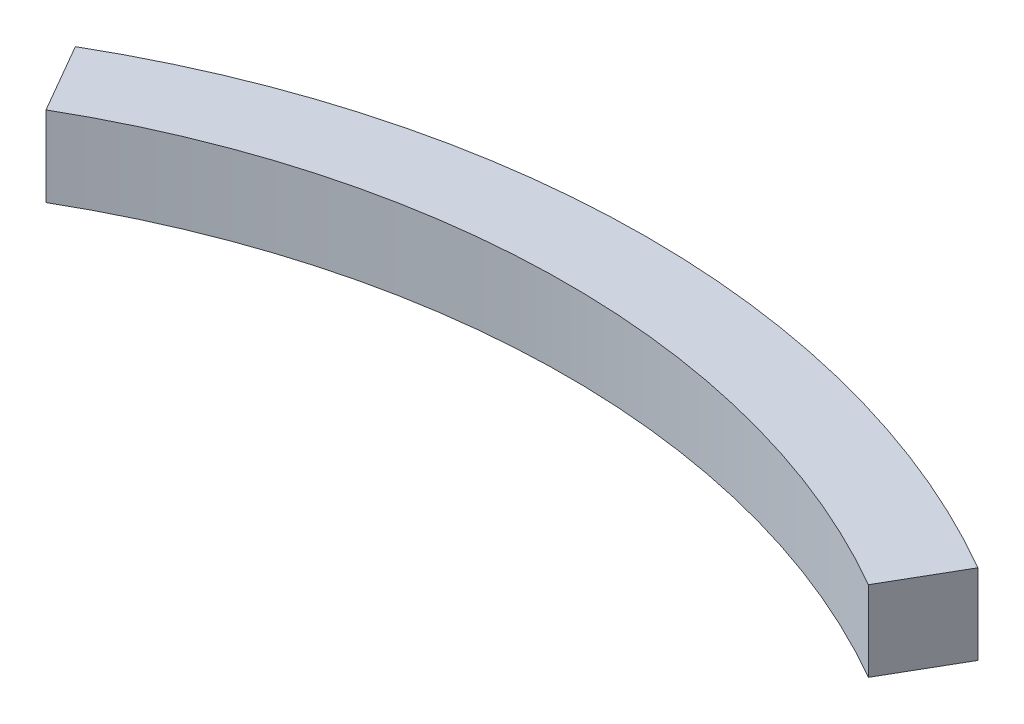
ISO-10303-21;
HEADER;
FILE_DESCRIPTION(('STEP AP214'),'2;1');
FILE_NAME('part.step','',(''),(''),'','','');
FILE_SCHEMA(('AUTOMOTIVE_DESIGN { 1 0 10303 214 1 1 1 1 }'));
ENDSEC;
DATA;
#1=APPLICATION_CONTEXT('core data for automotive mechanical design processes');
#2=APPLICATION_PROTOCOL_DEFINITION('international standard','automotive_design',2000,#1);
#3=PRODUCT_CONTEXT('',#1,'mechanical');
#4=PRODUCT('Part','Part','',(#3));
#5=PRODUCT_RELATED_PRODUCT_CATEGORY('part','',(#4));
#6=PRODUCT_DEFINITION_FORMATION('','',#4);
#7=PRODUCT_DEFINITION_CONTEXT('part definition',#1,'design');
#8=PRODUCT_DEFINITION('design','',#6,#7);
#9=PRODUCT_DEFINITION_SHAPE('','',#8);
#10=(LENGTH_UNIT() NAMED_UNIT(*) SI_UNIT(.MILLI.,.METRE.));
#11=(NAMED_UNIT(*) PLANE_ANGLE_UNIT() SI_UNIT($,.RADIAN.));
#12=(NAMED_UNIT(*) SI_UNIT($,.STERADIAN.) SOLID_ANGLE_UNIT());
#13=UNCERTAINTY_MEASURE_WITH_UNIT(LENGTH_MEASURE(1.E-05),#10,'distance_accuracy_value','');
#14=(GEOMETRIC_REPRESENTATION_CONTEXT(3) GLOBAL_UNCERTAINTY_ASSIGNED_CONTEXT((#13)) GLOBAL_UNIT_ASSIGNED_CONTEXT((#10,
#11,#12)) REPRESENTATION_CONTEXT('',''));
#15=CARTESIAN_POINT('',(0.,0.,0.));
#16=DIRECTION('',(0.,0.,1.));
#17=DIRECTION('',(1.,0.,0.));
#18=AXIS2_PLACEMENT_3D('',#15,#16,#17);
#19=CARTESIAN_POINT('',(0.,1.,0.));
#20=DIRECTION('',(0.,-1.,0.));
#21=DIRECTION('',(0.,0.,-1.));
#22=AXIS2_PLACEMENT_3D('',#19,#20,#21);
#23=CYLINDRICAL_SURFACE('',#22,10.25);
#24=CARTESIAN_POINT('',(0.,0.,0.));
#25=DIRECTION('',(0.,-1.,0.));
#26=DIRECTION('',(0.,0.,-1.));
#27=AXIS2_PLACEMENT_3D('',#24,#25,#26);
#28=CIRCLE('',#27,10.25);
#29=CARTESIAN_POINT('',(-5.12500000000001,0.,-8.87676038879049));
#30=VERTEX_POINT('',#29);
#31=CARTESIAN_POINT('',(5.12500000000001,0.,-8.87676038879049));
#32=VERTEX_POINT('',#31);
#33=EDGE_CURVE('E94',#30,#32,#28,.T.);
#34=ORIENTED_EDGE('',*,*,#33,.T.);
#35=DIRECTION('',(0.,-1.,0.));
#36=VECTOR('',#35,1.);
#37=CARTESIAN_POINT('',(5.12500000000001,1.,-8.87676038879049));
#38=LINE('',#37,#36);
#39=CARTESIAN_POINT('',(5.12500000000001,1.,-8.87676038879049));
#40=VERTEX_POINT('',#39);
#41=EDGE_CURVE('E11',#40,#32,#38,.T.);
#42=ORIENTED_EDGE('',*,*,#41,.F.);
#43=CARTESIAN_POINT('',(0.,1.,0.));
#44=DIRECTION('',(0.,-1.,0.));
#45=DIRECTION('',(0.,0.,-1.));
#46=AXIS2_PLACEMENT_3D('',#43,#44,#45);
#47=CIRCLE('',#46,10.25);
#48=CARTESIAN_POINT('',(-5.12500000000001,1.,-8.87676038879049));
#49=VERTEX_POINT('',#48);
#50=EDGE_CURVE('E82',#49,#40,#47,.T.);
#51=ORIENTED_EDGE('',*,*,#50,.F.);
#52=DIRECTION('',(0.,-1.,0.));
#53=VECTOR('',#52,1.);
#54=CARTESIAN_POINT('',(-5.12500000000001,1.,-8.87676038879049));
#55=LINE('',#54,#53);
#56=EDGE_CURVE('E90',#49,#30,#55,.T.);
#57=ORIENTED_EDGE('',*,*,#56,.T.);
#58=EDGE_LOOP('',(#34,#42,#51,#57));
#59=FACE_BOUND('',#58,.T.);
#60=ADVANCED_FACE('F31',(#59),#23,.F.);
#61=CARTESIAN_POINT('',(5.12500000000001,1.,-8.87676038879049));
#62=DIRECTION('',(-0.866025403784438,0.,-0.500000000000001));
#63=DIRECTION('',(-0.500000000000001,0.,0.866025403784438));
#64=AXIS2_PLACEMENT_3D('',#61,#62,#63);
#65=PLANE('',#64);
#66=DIRECTION('',(0.500000000000001,0.,-0.866025403784438));
#67=VECTOR('',#66,1.);
#68=CARTESIAN_POINT('',(5.12500000000001,0.,-8.87676038879049));
#69=LINE('',#68,#67);
#70=CARTESIAN_POINT('',(5.62500000000001,0.,-9.74278579257493));
#71=VERTEX_POINT('',#70);
#72=EDGE_CURVE('E86',#32,#71,#69,.T.);
#73=ORIENTED_EDGE('',*,*,#72,.T.);
#74=DIRECTION('',(0.,-1.,0.));
#75=VECTOR('',#74,1.);
#76=CARTESIAN_POINT('',(5.62500000000001,1.,-9.74278579257493));
#77=LINE('',#76,#75);
#78=CARTESIAN_POINT('',(5.62500000000001,1.,-9.74278579257493));
#79=VERTEX_POINT('',#78);
#80=EDGE_CURVE('E39',#79,#71,#77,.T.);
#81=ORIENTED_EDGE('',*,*,#80,.F.);
#82=DIRECTION('',(0.500000000000001,0.,-0.866025403784438));
#83=VECTOR('',#82,1.);
#84=CARTESIAN_POINT('',(5.12500000000001,1.,-8.87676038879049));
#85=LINE('',#84,#83);
#86=EDGE_CURVE('E77',#40,#79,#85,.T.);
#87=ORIENTED_EDGE('',*,*,#86,.F.);
#88=ORIENTED_EDGE('',*,*,#41,.T.);
#89=EDGE_LOOP('',(#73,#81,#87,#88));
#90=FACE_BOUND('',#89,.T.);
#91=ADVANCED_FACE('F85',(#90),#65,.F.);
#92=CARTESIAN_POINT('',(0.,1.,0.));
#93=DIRECTION('',(0.,-1.,0.));
#94=DIRECTION('',(0.,0.,-1.));
#95=AXIS2_PLACEMENT_3D('',#92,#93,#94);
#96=CYLINDRICAL_SURFACE('',#95,11.25);
#97=CARTESIAN_POINT('',(0.,0.,0.));
#98=DIRECTION('',(0.,1.,0.));
#99=DIRECTION('',(0.,0.,-1.));
#100=AXIS2_PLACEMENT_3D('',#97,#98,#99);
#101=CIRCLE('',#100,11.25);
#102=CARTESIAN_POINT('',(-5.62500000000001,0.,-9.74278579257493));
#103=VERTEX_POINT('',#102);
#104=EDGE_CURVE('E64',#71,#103,#101,.T.);
#105=ORIENTED_EDGE('',*,*,#104,.T.);
#106=DIRECTION('',(0.,-1.,0.));
#107=VECTOR('',#106,1.);
#108=CARTESIAN_POINT('',(-5.62500000000001,1.,-9.74278579257493));
#109=LINE('',#108,#107);
#110=CARTESIAN_POINT('',(-5.62500000000001,1.,-9.74278579257493));
#111=VERTEX_POINT('',#110);
#112=EDGE_CURVE('E87',#111,#103,#109,.T.);
#113=ORIENTED_EDGE('',*,*,#112,.F.);
#114=CARTESIAN_POINT('',(0.,1.,0.));
#115=DIRECTION('',(0.,1.,0.));
#116=DIRECTION('',(0.,0.,-1.));
#117=AXIS2_PLACEMENT_3D('',#114,#115,#116);
#118=CIRCLE('',#117,11.25);
#119=EDGE_CURVE('E80',#79,#111,#118,.T.);
#120=ORIENTED_EDGE('',*,*,#119,.F.);
#121=ORIENTED_EDGE('',*,*,#80,.T.);
#122=EDGE_LOOP('',(#105,#113,#120,#121));
#123=FACE_BOUND('',#122,.T.);
#124=ADVANCED_FACE('F88',(#123),#96,.T.);
#125=CARTESIAN_POINT('',(-5.12500000000001,1.,-8.87676038879049));
#126=DIRECTION('',(0.866025403784438,0.,-0.500000000000001));
#127=DIRECTION('',(-0.500000000000001,0.,-0.866025403784438));
#128=AXIS2_PLACEMENT_3D('',#125,#126,#127);
#129=PLANE('',#128);
#130=DIRECTION('',(0.500000000000001,0.,0.866025403784438));
#131=VECTOR('',#130,1.);
#132=CARTESIAN_POINT('',(-5.12500000000001,0.,-8.87676038879049));
#133=LINE('',#132,#131);
#134=EDGE_CURVE('E70',#103,#30,#133,.T.);
#135=ORIENTED_EDGE('',*,*,#134,.T.);
#136=ORIENTED_EDGE('',*,*,#56,.F.);
#137=DIRECTION('',(0.500000000000001,0.,0.866025403784438));
#138=VECTOR('',#137,1.);
#139=CARTESIAN_POINT('',(-5.12500000000001,1.,-8.87676038879049));
#140=LINE('',#139,#138);
#141=EDGE_CURVE('E47',#111,#49,#140,.T.);
#142=ORIENTED_EDGE('',*,*,#141,.F.);
#143=ORIENTED_EDGE('',*,*,#112,.T.);
#144=EDGE_LOOP('',(#135,#136,#142,#143));
#145=FACE_BOUND('',#144,.T.);
#146=ADVANCED_FACE('F101',(#145),#129,.F.);
#147=CARTESIAN_POINT('',(0.,1.,0.));
#148=DIRECTION('',(0.,-1.,0.));
#149=DIRECTION('',(0.,0.,-1.));
#150=AXIS2_PLACEMENT_3D('',#147,#148,#149);
#151=PLANE('',#150);
#152=ORIENTED_EDGE('',*,*,#50,.T.);
#153=ORIENTED_EDGE('',*,*,#86,.T.);
#154=ORIENTED_EDGE('',*,*,#119,.T.);
#155=ORIENTED_EDGE('',*,*,#141,.T.);
#156=EDGE_LOOP('',(#152,#153,#154,#155));
#157=FACE_BOUND('',#156,.T.);
#158=ADVANCED_FACE('F78',(#157),#151,.F.);
#159=CARTESIAN_POINT('',(0.,0.,0.));
#160=DIRECTION('',(0.,-1.,0.));
#161=DIRECTION('',(0.,0.,-1.));
#162=AXIS2_PLACEMENT_3D('',#159,#160,#161);
#163=PLANE('',#162);
#164=ORIENTED_EDGE('',*,*,#33,.F.);
#165=ORIENTED_EDGE('',*,*,#134,.F.);
#166=ORIENTED_EDGE('',*,*,#104,.F.);
#167=ORIENTED_EDGE('',*,*,#72,.F.);
#168=EDGE_LOOP('',(#164,#165,#166,#167));
#169=FACE_BOUND('',#168,.T.);
#170=ADVANCED_FACE('F104',(#169),#163,.T.);
#171=CLOSED_SHELL('',(#60,#91,#124,#146,#158,#170));
#172=MANIFOLD_SOLID_BREP('B2',#171);
#173=ADVANCED_BREP_SHAPE_REPRESENTATION('',(#18,#172),#14);
#174=SHAPE_DEFINITION_REPRESENTATION(#9,#173);
ENDSEC;
END-ISO-10303-21;
